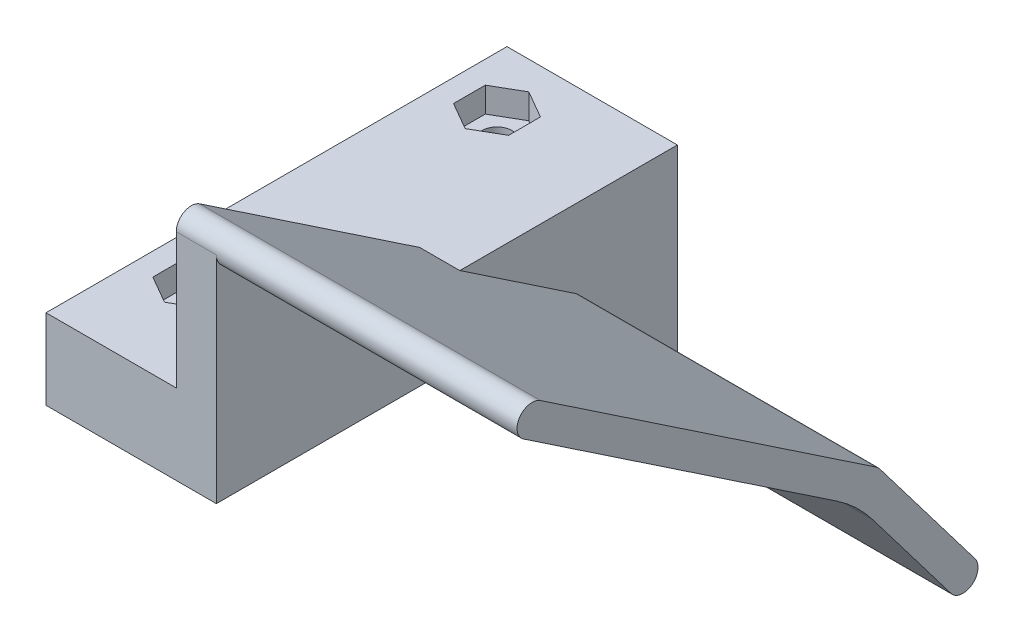
ISO-10303-21;
HEADER;
FILE_DESCRIPTION(('STEP AP214'),'2;1');
FILE_NAME('part.step','',(''),(''),'','','');
FILE_SCHEMA(('AUTOMOTIVE_DESIGN { 1 0 10303 214 1 1 1 1 }'));
ENDSEC;
DATA;
#1=APPLICATION_CONTEXT('core data for automotive mechanical design processes');
#2=APPLICATION_PROTOCOL_DEFINITION('international standard','automotive_design',2000,#1);
#3=PRODUCT_CONTEXT('',#1,'mechanical');
#4=PRODUCT('Part','Part','',(#3));
#5=PRODUCT_RELATED_PRODUCT_CATEGORY('part','',(#4));
#6=PRODUCT_DEFINITION_FORMATION('','',#4);
#7=PRODUCT_DEFINITION_CONTEXT('part definition',#1,'design');
#8=PRODUCT_DEFINITION('design','',#6,#7);
#9=PRODUCT_DEFINITION_SHAPE('','',#8);
#10=(LENGTH_UNIT() NAMED_UNIT(*) SI_UNIT(.MILLI.,.METRE.));
#11=(NAMED_UNIT(*) PLANE_ANGLE_UNIT() SI_UNIT($,.RADIAN.));
#12=(NAMED_UNIT(*) SI_UNIT($,.STERADIAN.) SOLID_ANGLE_UNIT());
#13=UNCERTAINTY_MEASURE_WITH_UNIT(LENGTH_MEASURE(1.E-05),#10,'distance_accuracy_value','');
#14=(GEOMETRIC_REPRESENTATION_CONTEXT(3) GLOBAL_UNCERTAINTY_ASSIGNED_CONTEXT((#13)) GLOBAL_UNIT_ASSIGNED_CONTEXT((#10,
#11,#12)) REPRESENTATION_CONTEXT('',''));
#15=CARTESIAN_POINT('',(0.,0.,0.));
#16=DIRECTION('',(0.,0.,1.));
#17=DIRECTION('',(1.,0.,0.));
#18=AXIS2_PLACEMENT_3D('',#15,#16,#17);
#19=CARTESIAN_POINT('',(61.,-8.,-10.));
#20=DIRECTION('',(0.,1.,0.));
#21=DIRECTION('',(0.,0.,-1.));
#22=AXIS2_PLACEMENT_3D('',#19,#20,#21);
#23=CYLINDRICAL_SURFACE('',#22,1.5);
#24=CARTESIAN_POINT('',(61.,-8.,-10.));
#25=DIRECTION('',(0.,-1.,0.));
#26=DIRECTION('',(0.,0.,-1.));
#27=AXIS2_PLACEMENT_3D('',#24,#25,#26);
#28=CIRCLE('',#27,1.5);
#29=CARTESIAN_POINT('',(61.,-8.,-11.5));
#30=VERTEX_POINT('',#29);
#31=EDGE_CURVE('E427',#30,#30,#28,.T.);
#32=ORIENTED_EDGE('',*,*,#31,.T.);
#33=EDGE_LOOP('',(#32));
#34=FACE_BOUND('',#33,.T.);
#35=CARTESIAN_POINT('',(61.,-2.5,-10.));
#36=DIRECTION('',(0.,-1.,0.));
#37=DIRECTION('',(0.,0.,-1.));
#38=AXIS2_PLACEMENT_3D('',#35,#36,#37);
#39=CIRCLE('',#38,1.5);
#40=CARTESIAN_POINT('',(61.,-2.5,-11.5));
#41=VERTEX_POINT('',#40);
#42=EDGE_CURVE('E51',#41,#41,#39,.F.);
#43=ORIENTED_EDGE('',*,*,#42,.T.);
#44=EDGE_LOOP('',(#43));
#45=FACE_BOUND('',#44,.T.);
#46=ADVANCED_FACE('F47',(#34,#45),#23,.F.);
#47=CARTESIAN_POINT('',(61.,-8.,-40.));
#48=DIRECTION('',(0.,1.,0.));
#49=DIRECTION('',(0.,0.,-1.));
#50=AXIS2_PLACEMENT_3D('',#47,#48,#49);
#51=CYLINDRICAL_SURFACE('',#50,1.5);
#52=CARTESIAN_POINT('',(61.,-8.,-40.));
#53=DIRECTION('',(0.,-1.,0.));
#54=DIRECTION('',(0.,0.,-1.));
#55=AXIS2_PLACEMENT_3D('',#52,#53,#54);
#56=CIRCLE('',#55,1.5);
#57=CARTESIAN_POINT('',(61.,-8.,-41.5));
#58=VERTEX_POINT('',#57);
#59=EDGE_CURVE('E416',#58,#58,#56,.T.);
#60=ORIENTED_EDGE('',*,*,#59,.T.);
#61=EDGE_LOOP('',(#60));
#62=FACE_BOUND('',#61,.T.);
#63=CARTESIAN_POINT('',(61.,-2.5,-40.));
#64=DIRECTION('',(0.,-1.,0.));
#65=DIRECTION('',(0.,0.,-1.));
#66=AXIS2_PLACEMENT_3D('',#63,#64,#65);
#67=CIRCLE('',#66,1.5);
#68=CARTESIAN_POINT('',(61.,-2.5,-41.5));
#69=VERTEX_POINT('',#68);
#70=EDGE_CURVE('E284',#69,#69,#67,.F.);
#71=ORIENTED_EDGE('',*,*,#70,.T.);
#72=EDGE_LOOP('',(#71));
#73=FACE_BOUND('',#72,.T.);
#74=ADVANCED_FACE('F483',(#62,#73),#51,.F.);
#75=CARTESIAN_POINT('',(56.,-8.,0.));
#76=DIRECTION('',(0.,0.,1.));
#77=DIRECTION('',(-1.,0.,0.));
#78=AXIS2_PLACEMENT_3D('',#75,#76,#77);
#79=PLANE('',#78);
#80=DIRECTION('',(0.,1.,0.));
#81=VECTOR('',#80,1.);
#82=CARTESIAN_POINT('',(69.,-23.,0.));
#83=LINE('',#82,#81);
#84=CARTESIAN_POINT('',(69.,0.,0.));
#85=VERTEX_POINT('',#84);
#86=CARTESIAN_POINT('',(69.,13.5,0.));
#87=VERTEX_POINT('',#86);
#88=EDGE_CURVE('E417',#85,#87,#83,.T.);
#89=ORIENTED_EDGE('',*,*,#88,.F.);
#90=DIRECTION('',(-1.,0.,0.));
#91=VECTOR('',#90,1.);
#92=CARTESIAN_POINT('',(56.,0.,0.));
#93=LINE('',#92,#91);
#94=CARTESIAN_POINT('',(56.,0.,0.));
#95=VERTEX_POINT('',#94);
#96=EDGE_CURVE('E448',#85,#95,#93,.T.);
#97=ORIENTED_EDGE('',*,*,#96,.T.);
#98=DIRECTION('',(0.,1.,0.));
#99=VECTOR('',#98,1.);
#100=CARTESIAN_POINT('',(56.,-8.,0.));
#101=LINE('',#100,#99);
#102=CARTESIAN_POINT('',(56.,-8.,0.));
#103=VERTEX_POINT('',#102);
#104=EDGE_CURVE('E443',#103,#95,#101,.T.);
#105=ORIENTED_EDGE('',*,*,#104,.F.);
#106=DIRECTION('',(-1.,0.,0.));
#107=VECTOR('',#106,1.);
#108=CARTESIAN_POINT('',(56.,-8.,0.));
#109=LINE('',#108,#107);
#110=CARTESIAN_POINT('',(73.,-8.,0.));
#111=VERTEX_POINT('',#110);
#112=EDGE_CURVE('E438',#111,#103,#109,.T.);
#113=ORIENTED_EDGE('',*,*,#112,.F.);
#114=DIRECTION('',(0.,1.,0.));
#115=VECTOR('',#114,1.);
#116=CARTESIAN_POINT('',(73.,-23.,0.));
#117=LINE('',#116,#115);
#118=CARTESIAN_POINT('',(73.,13.5,0.));
#119=VERTEX_POINT('',#118);
#120=EDGE_CURVE('E420',#111,#119,#117,.T.);
#121=ORIENTED_EDGE('',*,*,#120,.T.);
#122=DIRECTION('',(1.,0.,0.));
#123=VECTOR('',#122,1.);
#124=CARTESIAN_POINT('',(55.999,13.5,0.));
#125=LINE('',#124,#123);
#126=EDGE_CURVE('E337',#87,#119,#125,.T.);
#127=ORIENTED_EDGE('',*,*,#126,.F.);
#128=EDGE_LOOP('',(#89,#97,#105,#113,#121,#127));
#129=FACE_BOUND('',#128,.T.);
#130=ADVANCED_FACE('F489',(#129),#79,.T.);
#131=CARTESIAN_POINT('',(69.,-23.,-46.));
#132=DIRECTION('',(-1.,0.,0.));
#133=DIRECTION('',(0.,0.,-1.));
#134=AXIS2_PLACEMENT_3D('',#131,#132,#133);
#135=PLANE('',#134);
#136=CARTESIAN_POINT('',(69.,13.5,-1.5));
#137=DIRECTION('',(1.,0.,0.));
#138=DIRECTION('',(0.,0.,-1.));
#139=AXIS2_PLACEMENT_3D('',#136,#137,#138);
#140=CIRCLE('',#139,1.5);
#141=CARTESIAN_POINT('',(69.,14.7452088098158,-2.33633427524944));
#142=VERTEX_POINT('',#141);
#143=EDGE_CURVE('E344',#142,#87,#140,.T.);
#144=ORIENTED_EDGE('',*,*,#143,.F.);
#145=DIRECTION('',(0.,0.55755618349963,0.830139206543895));
#146=VECTOR('',#145,1.);
#147=CARTESIAN_POINT('',(69.,11.2427525617348,-7.55110246683679));
#148=LINE('',#147,#146);
#149=CARTESIAN_POINT('',(69.,0.,-24.2903118365308));
#150=VERTEX_POINT('',#149);
#151=EDGE_CURVE('E351',#150,#142,#148,.T.);
#152=ORIENTED_EDGE('',*,*,#151,.F.);
#153=DIRECTION('',(0.,0.,1.));
#154=VECTOR('',#153,1.);
#155=CARTESIAN_POINT('',(69.,0.,0.));
#156=LINE('',#155,#154);
#157=EDGE_CURVE('E446',#150,#85,#156,.T.);
#158=ORIENTED_EDGE('',*,*,#157,.T.);
#159=ORIENTED_EDGE('',*,*,#88,.T.);
#160=EDGE_LOOP('',(#144,#152,#158,#159));
#161=FACE_BOUND('',#160,.T.);
#162=ADVANCED_FACE('F509',(#161),#135,.T.);
#163=CARTESIAN_POINT('',(69.,-8.,-46.));
#164=DIRECTION('',(0.,0.,-1.));
#165=DIRECTION('',(1.,0.,0.));
#166=AXIS2_PLACEMENT_3D('',#163,#164,#165);
#167=PLANE('',#166);
#168=DIRECTION('',(0.,1.,0.));
#169=VECTOR('',#168,1.);
#170=CARTESIAN_POINT('',(69.,-23.,-46.));
#171=LINE('',#170,#169);
#172=CARTESIAN_POINT('',(69.,-21.5,-46.));
#173=VERTEX_POINT('',#172);
#174=CARTESIAN_POINT('',(69.,-8.,-46.));
#175=VERTEX_POINT('',#174);
#176=EDGE_CURVE('E413',#173,#175,#171,.T.);
#177=ORIENTED_EDGE('',*,*,#176,.T.);
#178=DIRECTION('',(1.,0.,0.));
#179=VECTOR('',#178,1.);
#180=CARTESIAN_POINT('',(69.,-8.,-46.));
#181=LINE('',#180,#179);
#182=CARTESIAN_POINT('',(56.,-8.,-46.));
#183=VERTEX_POINT('',#182);
#184=EDGE_CURVE('E431',#183,#175,#181,.T.);
#185=ORIENTED_EDGE('',*,*,#184,.F.);
#186=DIRECTION('',(0.,1.,0.));
#187=VECTOR('',#186,1.);
#188=CARTESIAN_POINT('',(56.,-8.,-46.));
#189=LINE('',#188,#187);
#190=CARTESIAN_POINT('',(56.,0.,-46.));
#191=VERTEX_POINT('',#190);
#192=EDGE_CURVE('E452',#183,#191,#189,.T.);
#193=ORIENTED_EDGE('',*,*,#192,.T.);
#194=DIRECTION('',(1.,0.,0.));
#195=VECTOR('',#194,1.);
#196=CARTESIAN_POINT('',(69.,0.,-46.));
#197=LINE('',#196,#195);
#198=CARTESIAN_POINT('',(73.,0.,-46.));
#199=VERTEX_POINT('',#198);
#200=EDGE_CURVE('E430',#191,#199,#197,.T.);
#201=ORIENTED_EDGE('',*,*,#200,.T.);
#202=DIRECTION('',(0.,1.,0.));
#203=VECTOR('',#202,1.);
#204=CARTESIAN_POINT('',(73.,-23.,-46.));
#205=LINE('',#204,#203);
#206=CARTESIAN_POINT('',(73.,-21.5,-46.));
#207=VERTEX_POINT('',#206);
#208=EDGE_CURVE('E412',#207,#199,#205,.T.);
#209=ORIENTED_EDGE('',*,*,#208,.F.);
#210=DIRECTION('',(1.,0.,0.));
#211=VECTOR('',#210,1.);
#212=CARTESIAN_POINT('',(55.999,-21.5,-46.));
#213=LINE('',#212,#211);
#214=EDGE_CURVE('E340',#173,#207,#213,.T.);
#215=ORIENTED_EDGE('',*,*,#214,.F.);
#216=EDGE_LOOP('',(#177,#185,#193,#201,#209,#215));
#217=FACE_BOUND('',#216,.T.);
#218=ADVANCED_FACE('F511',(#217),#167,.T.);
#219=CARTESIAN_POINT('',(69.,-21.5,-44.5));
#220=DIRECTION('',(1.,0.,0.));
#221=DIRECTION('',(0.,0.,-1.));
#222=AXIS2_PLACEMENT_3D('',#219,#220,#221);
#223=CIRCLE('',#222,1.5);
#224=CARTESIAN_POINT('',(69.,-22.4076249013003,-43.3057567088153));
#225=VERTEX_POINT('',#224);
#226=EDGE_CURVE('E360',#173,#225,#223,.F.);
#227=ORIENTED_EDGE('',*,*,#226,.T.);
#228=DIRECTION('',(0.,-0.796162194123103,-0.605083267533557));
#229=VECTOR('',#228,1.);
#230=CARTESIAN_POINT('',(69.,12.6582980195922,-16.6556552889371));
#231=LINE('',#230,#229);
#232=CARTESIAN_POINT('',(69.,-12.0915998308125,-35.4655776552446));
#233=VERTEX_POINT('',#232);
#234=EDGE_CURVE('E357',#233,#225,#231,.T.);
#235=ORIENTED_EDGE('',*,*,#234,.F.);
#236=CARTESIAN_POINT('',(69.,-21.1678488438159,-23.5231447433981));
#237=DIRECTION('',(1.,0.,0.));
#238=DIRECTION('',(0.,0.,-1.));
#239=AXIS2_PLACEMENT_3D('',#236,#237,#238);
#240=CIRCLE('',#239,15.);
#241=CARTESIAN_POINT('',(69.,-8.71576074565748,-31.8864874958925));
#242=VERTEX_POINT('',#241);
#243=EDGE_CURVE('E56',#242,#233,#240,.F.);
#244=ORIENTED_EDGE('',*,*,#243,.F.);
#245=DIRECTION('',(0.,0.55755618349963,0.830139206543895));
#246=VECTOR('',#245,1.);
#247=CARTESIAN_POINT('',(69.,8.75233494210309,-5.87843391633789));
#248=LINE('',#247,#246);
#249=CARTESIAN_POINT('',(69.,-8.,-30.8207992745803));
#250=VERTEX_POINT('',#249);
#251=EDGE_CURVE('E343',#242,#250,#248,.T.);
#252=ORIENTED_EDGE('',*,*,#251,.T.);
#253=DIRECTION('',(0.,0.,1.));
#254=VECTOR('',#253,1.);
#255=CARTESIAN_POINT('',(69.,-8.,0.));
#256=LINE('',#255,#254);
#257=EDGE_CURVE('E434',#175,#250,#256,.T.);
#258=ORIENTED_EDGE('',*,*,#257,.F.);
#259=ORIENTED_EDGE('',*,*,#176,.F.);
#260=EDGE_LOOP('',(#227,#235,#244,#252,#258,#259));
#261=FACE_BOUND('',#260,.T.);
#262=ADVANCED_FACE('F513',(#261),#135,.T.);
#263=CARTESIAN_POINT('',(73.,-23.,0.));
#264=DIRECTION('',(1.,0.,0.));
#265=DIRECTION('',(0.,0.,1.));
#266=AXIS2_PLACEMENT_3D('',#263,#264,#265);
#267=PLANE('',#266);
#268=DIRECTION('',(0.,-0.557556183499631,-0.830139206543894));
#269=VECTOR('',#268,1.);
#270=CARTESIAN_POINT('',(73.,8.7523349421031,-5.87843391633791));
#271=LINE('',#270,#269);
#272=CARTESIAN_POINT('',(73.,12.2547911901842,-0.663665724750555));
#273=VERTEX_POINT('',#272);
#274=CARTESIAN_POINT('',(73.,-7.99999999999999,-30.8207992745803));
#275=VERTEX_POINT('',#274);
#276=EDGE_CURVE('E397',#273,#275,#271,.T.);
#277=ORIENTED_EDGE('',*,*,#276,.F.);
#278=CARTESIAN_POINT('',(73.,13.5,-1.5));
#279=DIRECTION('',(-1.,0.,0.));
#280=DIRECTION('',(0.,0.,1.));
#281=AXIS2_PLACEMENT_3D('',#278,#279,#280);
#282=CIRCLE('',#281,1.5);
#283=EDGE_CURVE('E370',#273,#119,#282,.T.);
#284=ORIENTED_EDGE('',*,*,#283,.T.);
#285=ORIENTED_EDGE('',*,*,#120,.F.);
#286=DIRECTION('',(0.,0.,1.));
#287=VECTOR('',#286,1.);
#288=CARTESIAN_POINT('',(73.,-8.,0.));
#289=LINE('',#288,#287);
#290=EDGE_CURVE('E363',#275,#111,#289,.T.);
#291=ORIENTED_EDGE('',*,*,#290,.F.);
#292=EDGE_LOOP('',(#277,#284,#285,#291));
#293=FACE_BOUND('',#292,.T.);
#294=ADVANCED_FACE('F519',(#293),#267,.T.);
#295=DIRECTION('',(0.,-0.55755618349963,-0.830139206543895));
#296=VECTOR('',#295,1.);
#297=CARTESIAN_POINT('',(73.,11.2427525617348,-7.55110246683679));
#298=LINE('',#297,#296);
#299=CARTESIAN_POINT('',(73.,0.,-24.2903118365308));
#300=VERTEX_POINT('',#299);
#301=CARTESIAN_POINT('',(73.,-7.75479119018416,-35.8363342752494));
#302=VERTEX_POINT('',#301);
#303=EDGE_CURVE('E354',#300,#302,#298,.T.);
#304=ORIENTED_EDGE('',*,*,#303,.T.);
#305=CARTESIAN_POINT('',(73.,-9.,-35.));
#306=DIRECTION('',(-1.,0.,0.));
#307=DIRECTION('',(0.,0.,1.));
#308=AXIS2_PLACEMENT_3D('',#305,#306,#307);
#309=CIRCLE('',#308,1.49999999999999);
#310=CARTESIAN_POINT('',(73.,-8.09237509869968,-36.1942432911846));
#311=VERTEX_POINT('',#310);
#312=EDGE_CURVE('E389',#302,#311,#309,.T.);
#313=ORIENTED_EDGE('',*,*,#312,.T.);
#314=DIRECTION('',(0.,-0.796162194123103,-0.605083267533557));
#315=VECTOR('',#314,1.);
#316=CARTESIAN_POINT('',(73.,14.4735478221928,-19.0441418713064));
#317=LINE('',#316,#315);
#318=CARTESIAN_POINT('',(73.,-20.5923750986997,-45.6942432911846));
#319=VERTEX_POINT('',#318);
#320=EDGE_CURVE('E392',#311,#319,#317,.T.);
#321=ORIENTED_EDGE('',*,*,#320,.T.);
#322=CARTESIAN_POINT('',(73.,-21.5,-44.5));
#323=DIRECTION('',(-1.,0.,0.));
#324=DIRECTION('',(0.,0.,1.));
#325=AXIS2_PLACEMENT_3D('',#322,#323,#324);
#326=CIRCLE('',#325,1.49999999999999);
#327=EDGE_CURVE('E395',#319,#207,#326,.T.);
#328=ORIENTED_EDGE('',*,*,#327,.T.);
#329=ORIENTED_EDGE('',*,*,#208,.T.);
#330=DIRECTION('',(0.,0.,-1.));
#331=VECTOR('',#330,1.);
#332=CARTESIAN_POINT('',(73.,0.,0.));
#333=LINE('',#332,#331);
#334=EDGE_CURVE('E346',#300,#199,#333,.T.);
#335=ORIENTED_EDGE('',*,*,#334,.F.);
#336=EDGE_LOOP('',(#304,#313,#321,#328,#329,#335));
#337=FACE_BOUND('',#336,.T.);
#338=ADVANCED_FACE('F506',(#337),#267,.T.);
#339=CARTESIAN_POINT('',(56.,-8.,0.));
#340=DIRECTION('',(-1.,0.,0.));
#341=DIRECTION('',(0.,0.,-1.));
#342=AXIS2_PLACEMENT_3D('',#339,#340,#341);
#343=PLANE('',#342);
#344=DIRECTION('',(0.,0.,-1.));
#345=VECTOR('',#344,1.);
#346=CARTESIAN_POINT('',(56.,0.,0.));
#347=LINE('',#346,#345);
#348=EDGE_CURVE('E435',#95,#191,#347,.T.);
#349=ORIENTED_EDGE('',*,*,#348,.T.);
#350=ORIENTED_EDGE('',*,*,#192,.F.);
#351=DIRECTION('',(0.,0.,-1.));
#352=VECTOR('',#351,1.);
#353=CARTESIAN_POINT('',(56.,-8.,0.));
#354=LINE('',#353,#352);
#355=EDGE_CURVE('E441',#103,#183,#354,.T.);
#356=ORIENTED_EDGE('',*,*,#355,.F.);
#357=ORIENTED_EDGE('',*,*,#104,.T.);
#358=EDGE_LOOP('',(#349,#350,#356,#357));
#359=FACE_BOUND('',#358,.T.);
#360=ADVANCED_FACE('F498',(#359),#343,.T.);
#361=CARTESIAN_POINT('',(0.,-8.,0.));
#362=DIRECTION('',(0.,1.,0.));
#363=DIRECTION('',(0.,0.,-1.));
#364=AXIS2_PLACEMENT_3D('',#361,#362,#363);
#365=PLANE('',#364);
#366=ORIENTED_EDGE('',*,*,#59,.F.);
#367=EDGE_LOOP('',(#366));
#368=FACE_BOUND('',#367,.T.);
#369=ORIENTED_EDGE('',*,*,#31,.F.);
#370=EDGE_LOOP('',(#369));
#371=FACE_BOUND('',#370,.T.);
#372=ORIENTED_EDGE('',*,*,#184,.T.);
#373=ORIENTED_EDGE('',*,*,#257,.T.);
#374=DIRECTION('',(1.,0.,0.));
#375=VECTOR('',#374,1.);
#376=CARTESIAN_POINT('',(55.999,-8.,-30.8207992745803));
#377=LINE('',#376,#375);
#378=EDGE_CURVE('E347',#250,#275,#377,.T.);
#379=ORIENTED_EDGE('',*,*,#378,.T.);
#380=ORIENTED_EDGE('',*,*,#290,.T.);
#381=ORIENTED_EDGE('',*,*,#112,.T.);
#382=ORIENTED_EDGE('',*,*,#355,.T.);
#383=EDGE_LOOP('',(#372,#373,#379,#380,#381,#382));
#384=FACE_BOUND('',#383,.T.);
#385=ADVANCED_FACE('F494',(#368,#371,#384),#365,.F.);
#386=CARTESIAN_POINT('',(0.,0.,0.));
#387=DIRECTION('',(0.,1.,0.));
#388=DIRECTION('',(0.,0.,-1.));
#389=AXIS2_PLACEMENT_3D('',#386,#387,#388);
#390=PLANE('',#389);
#391=DIRECTION('',(0.866025403784437,0.,0.500000000000003));
#392=VECTOR('',#391,1.);
#393=CARTESIAN_POINT('',(61.,0.,-13.1754264805429));
#394=LINE('',#393,#392);
#395=CARTESIAN_POINT('',(61.,0.,-13.1754264805429));
#396=VERTEX_POINT('',#395);
#397=CARTESIAN_POINT('',(63.75,0.,-11.5877132402715));
#398=VERTEX_POINT('',#397);
#399=EDGE_CURVE('E271',#396,#398,#394,.T.);
#400=ORIENTED_EDGE('',*,*,#399,.T.);
#401=DIRECTION('',(0.,0.,1.));
#402=VECTOR('',#401,1.);
#403=CARTESIAN_POINT('',(63.75,0.,-11.5877132402715));
#404=LINE('',#403,#402);
#405=CARTESIAN_POINT('',(63.75,0.,-8.41228675972853));
#406=VERTEX_POINT('',#405);
#407=EDGE_CURVE('E239',#398,#406,#404,.T.);
#408=ORIENTED_EDGE('',*,*,#407,.T.);
#409=DIRECTION('',(-0.866025403784439,0.,0.499999999999999));
#410=VECTOR('',#409,1.);
#411=CARTESIAN_POINT('',(63.75,0.,-8.41228675972853));
#412=LINE('',#411,#410);
#413=CARTESIAN_POINT('',(61.,0.,-6.82457351945707));
#414=VERTEX_POINT('',#413);
#415=EDGE_CURVE('E275',#406,#414,#412,.T.);
#416=ORIENTED_EDGE('',*,*,#415,.T.);
#417=DIRECTION('',(-0.866025403784437,0.,-0.500000000000002));
#418=VECTOR('',#417,1.);
#419=CARTESIAN_POINT('',(61.,0.,-6.82457351945707));
#420=LINE('',#419,#418);
#421=CARTESIAN_POINT('',(58.25,0.,-8.41228675972854));
#422=VERTEX_POINT('',#421);
#423=EDGE_CURVE('E278',#414,#422,#420,.T.);
#424=ORIENTED_EDGE('',*,*,#423,.T.);
#425=DIRECTION('',(0.,0.,-1.));
#426=VECTOR('',#425,1.);
#427=CARTESIAN_POINT('',(58.25,0.,-8.41228675972854));
#428=LINE('',#427,#426);
#429=CARTESIAN_POINT('',(58.25,0.,-11.5877132402715));
#430=VERTEX_POINT('',#429);
#431=EDGE_CURVE('E260',#422,#430,#428,.T.);
#432=ORIENTED_EDGE('',*,*,#431,.T.);
#433=DIRECTION('',(0.866025403784439,0.,-0.5));
#434=VECTOR('',#433,1.);
#435=CARTESIAN_POINT('',(58.25,0.,-11.5877132402715));
#436=LINE('',#435,#434);
#437=EDGE_CURVE('E257',#430,#396,#436,.T.);
#438=ORIENTED_EDGE('',*,*,#437,.T.);
#439=EDGE_LOOP('',(#400,#408,#416,#424,#432,#438));
#440=FACE_BOUND('',#439,.T.);
#441=DIRECTION('',(0.866025403784438,0.,-0.5));
#442=VECTOR('',#441,1.);
#443=CARTESIAN_POINT('',(58.25,0.,-41.5877132402715));
#444=LINE('',#443,#442);
#445=CARTESIAN_POINT('',(58.25,0.,-41.5877132402715));
#446=VERTEX_POINT('',#445);
#447=CARTESIAN_POINT('',(61.,0.,-43.175426480543));
#448=VERTEX_POINT('',#447);
#449=EDGE_CURVE('E273',#446,#448,#444,.T.);
#450=ORIENTED_EDGE('',*,*,#449,.T.);
#451=DIRECTION('',(0.866025403784439,0.,0.5));
#452=VECTOR('',#451,1.);
#453=CARTESIAN_POINT('',(61.,0.,-43.1754264805429));
#454=LINE('',#453,#452);
#455=CARTESIAN_POINT('',(63.75,0.,-41.5877132402715));
#456=VERTEX_POINT('',#455);
#457=EDGE_CURVE('E317',#448,#456,#454,.T.);
#458=ORIENTED_EDGE('',*,*,#457,.T.);
#459=DIRECTION('',(0.,0.,1.));
#460=VECTOR('',#459,1.);
#461=CARTESIAN_POINT('',(63.75,0.,-41.5877132402715));
#462=LINE('',#461,#460);
#463=CARTESIAN_POINT('',(63.75,0.,-38.4122867597286));
#464=VERTEX_POINT('',#463);
#465=EDGE_CURVE('E314',#456,#464,#462,.T.);
#466=ORIENTED_EDGE('',*,*,#465,.T.);
#467=DIRECTION('',(-0.866025403784437,0.,0.500000000000002));
#468=VECTOR('',#467,1.);
#469=CARTESIAN_POINT('',(63.75,0.,-38.4122867597286));
#470=LINE('',#469,#468);
#471=CARTESIAN_POINT('',(61.,0.,-36.8245735194571));
#472=VERTEX_POINT('',#471);
#473=EDGE_CURVE('E311',#464,#472,#470,.T.);
#474=ORIENTED_EDGE('',*,*,#473,.T.);
#475=DIRECTION('',(-0.866025403784442,0.,-0.499999999999994));
#476=VECTOR('',#475,1.);
#477=CARTESIAN_POINT('',(61.,0.,-36.8245735194571));
#478=LINE('',#477,#476);
#479=CARTESIAN_POINT('',(58.25,0.,-38.4122867597285));
#480=VERTEX_POINT('',#479);
#481=EDGE_CURVE('E307',#472,#480,#478,.T.);
#482=ORIENTED_EDGE('',*,*,#481,.T.);
#483=DIRECTION('',(0.,0.,-1.));
#484=VECTOR('',#483,1.);
#485=CARTESIAN_POINT('',(58.25,0.,-38.4122867597285));
#486=LINE('',#485,#484);
#487=EDGE_CURVE('E304',#480,#446,#486,.T.);
#488=ORIENTED_EDGE('',*,*,#487,.T.);
#489=EDGE_LOOP('',(#450,#458,#466,#474,#482,#488));
#490=FACE_BOUND('',#489,.T.);
#491=ORIENTED_EDGE('',*,*,#200,.F.);
#492=ORIENTED_EDGE('',*,*,#348,.F.);
#493=ORIENTED_EDGE('',*,*,#96,.F.);
#494=ORIENTED_EDGE('',*,*,#157,.F.);
#495=DIRECTION('',(1.,0.,0.));
#496=VECTOR('',#495,1.);
#497=CARTESIAN_POINT('',(55.999,0.,-24.2903118365308));
#498=LINE('',#497,#496);
#499=EDGE_CURVE('E349',#150,#300,#498,.T.);
#500=ORIENTED_EDGE('',*,*,#499,.T.);
#501=ORIENTED_EDGE('',*,*,#334,.T.);
#502=EDGE_LOOP('',(#491,#492,#493,#494,#500,#501));
#503=FACE_BOUND('',#502,.T.);
#504=ADVANCED_FACE('F497',(#440,#490,#503),#390,.T.);
#505=CARTESIAN_POINT('',(103.,11.2427525617348,-7.55110246683679));
#506=DIRECTION('',(0.,-0.830139206543894,0.55755618349963));
#507=DIRECTION('',(0.,0.55755618349963,0.830139206543895));
#508=AXIS2_PLACEMENT_3D('',#505,#506,#507);
#509=PLANE('',#508);
#510=DIRECTION('',(-1.,0.,0.));
#511=VECTOR('',#510,1.);
#512=CARTESIAN_POINT('',(103.,14.7452088098158,-2.33633427524945));
#513=LINE('',#512,#511);
#514=CARTESIAN_POINT('',(103.,14.7452088098158,-2.33633427524945));
#515=VERTEX_POINT('',#514);
#516=EDGE_CURVE('E386',#515,#142,#513,.T.);
#517=ORIENTED_EDGE('',*,*,#516,.F.);
#518=DIRECTION('',(0.,-0.55755618349963,-0.830139206543895));
#519=VECTOR('',#518,1.);
#520=CARTESIAN_POINT('',(103.,11.2427525617348,-7.55110246683679));
#521=LINE('',#520,#519);
#522=CARTESIAN_POINT('',(103.,-7.75479119018416,-35.8363342752494));
#523=VERTEX_POINT('',#522);
#524=EDGE_CURVE('E366',#515,#523,#521,.T.);
#525=ORIENTED_EDGE('',*,*,#524,.T.);
#526=DIRECTION('',(-1.,0.,0.));
#527=VECTOR('',#526,1.);
#528=CARTESIAN_POINT('',(103.,-7.75479119018416,-35.8363342752494));
#529=LINE('',#528,#527);
#530=EDGE_CURVE('E410',#523,#302,#529,.T.);
#531=ORIENTED_EDGE('',*,*,#530,.T.);
#532=ORIENTED_EDGE('',*,*,#303,.F.);
#533=ORIENTED_EDGE('',*,*,#499,.F.);
#534=ORIENTED_EDGE('',*,*,#151,.T.);
#535=EDGE_LOOP('',(#517,#525,#531,#532,#533,#534));
#536=FACE_BOUND('',#535,.T.);
#537=ADVANCED_FACE('F502',(#536),#509,.F.);
#538=CARTESIAN_POINT('',(103.,-9.,-35.));
#539=DIRECTION('',(-1.,0.,0.));
#540=DIRECTION('',(0.,0.,-1.));
#541=AXIS2_PLACEMENT_3D('',#538,#539,#540);
#542=CYLINDRICAL_SURFACE('',#541,1.49999999999999);
#543=ORIENTED_EDGE('',*,*,#312,.F.);
#544=ORIENTED_EDGE('',*,*,#530,.F.);
#545=CARTESIAN_POINT('',(103.,-9.,-35.));
#546=DIRECTION('',(-1.,0.,0.));
#547=DIRECTION('',(0.,0.,1.));
#548=AXIS2_PLACEMENT_3D('',#545,#546,#547);
#549=CIRCLE('',#548,1.49999999999999);
#550=CARTESIAN_POINT('',(103.,-8.09237509869968,-36.1942432911846));
#551=VERTEX_POINT('',#550);
#552=EDGE_CURVE('E369',#523,#551,#549,.T.);
#553=ORIENTED_EDGE('',*,*,#552,.T.);
#554=DIRECTION('',(-1.,0.,0.));
#555=VECTOR('',#554,1.);
#556=CARTESIAN_POINT('',(103.,-8.09237509869968,-36.1942432911846));
#557=LINE('',#556,#555);
#558=EDGE_CURVE('E408',#551,#311,#557,.T.);
#559=ORIENTED_EDGE('',*,*,#558,.T.);
#560=EDGE_LOOP('',(#543,#544,#553,#559));
#561=FACE_BOUND('',#560,.T.);
#562=ADVANCED_FACE('F569',(#561),#542,.T.);
#563=CARTESIAN_POINT('',(103.,14.4735478221928,-19.0441418713064));
#564=DIRECTION('',(0.,-0.605083267533557,0.796162194123103));
#565=DIRECTION('',(0.,0.796162194123103,0.605083267533557));
#566=AXIS2_PLACEMENT_3D('',#563,#564,#565);
#567=PLANE('',#566);
#568=ORIENTED_EDGE('',*,*,#320,.F.);
#569=ORIENTED_EDGE('',*,*,#558,.F.);
#570=DIRECTION('',(0.,-0.796162194123103,-0.605083267533557));
#571=VECTOR('',#570,1.);
#572=CARTESIAN_POINT('',(103.,14.4735478221928,-19.0441418713064));
#573=LINE('',#572,#571);
#574=CARTESIAN_POINT('',(103.,-20.5923750986997,-45.6942432911846));
#575=VERTEX_POINT('',#574);
#576=EDGE_CURVE('E373',#551,#575,#573,.T.);
#577=ORIENTED_EDGE('',*,*,#576,.T.);
#578=DIRECTION('',(-1.,0.,0.));
#579=VECTOR('',#578,1.);
#580=CARTESIAN_POINT('',(103.,-20.5923750986997,-45.6942432911846));
#581=LINE('',#580,#579);
#582=EDGE_CURVE('E406',#575,#319,#581,.T.);
#583=ORIENTED_EDGE('',*,*,#582,.T.);
#584=EDGE_LOOP('',(#568,#569,#577,#583));
#585=FACE_BOUND('',#584,.T.);
#586=ADVANCED_FACE('F572',(#585),#567,.F.);
#587=CARTESIAN_POINT('',(103.,-21.5,-44.5));
#588=DIRECTION('',(-1.,0.,0.));
#589=DIRECTION('',(0.,0.,-1.));
#590=AXIS2_PLACEMENT_3D('',#587,#588,#589);
#591=CYLINDRICAL_SURFACE('',#590,1.49999999999999);
#592=ORIENTED_EDGE('',*,*,#327,.F.);
#593=ORIENTED_EDGE('',*,*,#582,.F.);
#594=CARTESIAN_POINT('',(103.,-21.5,-44.5));
#595=DIRECTION('',(-1.,0.,0.));
#596=DIRECTION('',(0.,0.,1.));
#597=AXIS2_PLACEMENT_3D('',#594,#595,#596);
#598=CIRCLE('',#597,1.49999999999999);
#599=CARTESIAN_POINT('',(103.,-22.4076249013003,-43.3057567088153));
#600=VERTEX_POINT('',#599);
#601=EDGE_CURVE('E376',#575,#600,#598,.T.);
#602=ORIENTED_EDGE('',*,*,#601,.T.);
#603=DIRECTION('',(-1.,0.,0.));
#604=VECTOR('',#603,1.);
#605=CARTESIAN_POINT('',(103.,-22.4076249013003,-43.3057567088153));
#606=LINE('',#605,#604);
#607=EDGE_CURVE('E404',#600,#225,#606,.T.);
#608=ORIENTED_EDGE('',*,*,#607,.T.);
#609=ORIENTED_EDGE('',*,*,#226,.F.);
#610=ORIENTED_EDGE('',*,*,#214,.T.);
#611=EDGE_LOOP('',(#592,#593,#602,#608,#609,#610));
#612=FACE_BOUND('',#611,.T.);
#613=ADVANCED_FACE('F545',(#612),#591,.T.);
#614=CARTESIAN_POINT('',(103.,12.6582980195922,-16.6556552889371));
#615=DIRECTION('',(0.,-0.605083267533557,0.796162194123103));
#616=DIRECTION('',(0.,0.796162194123103,0.605083267533557));
#617=AXIS2_PLACEMENT_3D('',#614,#615,#616);
#618=PLANE('',#617);
#619=ORIENTED_EDGE('',*,*,#234,.T.);
#620=ORIENTED_EDGE('',*,*,#607,.F.);
#621=DIRECTION('',(0.,-0.796162194123103,-0.605083267533557));
#622=VECTOR('',#621,1.);
#623=CARTESIAN_POINT('',(103.,12.6582980195922,-16.6556552889371));
#624=LINE('',#623,#622);
#625=CARTESIAN_POINT('',(103.,-12.0915998308125,-35.4655776552446));
#626=VERTEX_POINT('',#625);
#627=EDGE_CURVE('E379',#626,#600,#624,.T.);
#628=ORIENTED_EDGE('',*,*,#627,.F.);
#629=DIRECTION('',(-1.,0.,0.));
#630=VECTOR('',#629,1.);
#631=CARTESIAN_POINT('',(103.,-12.0915998308125,-35.4655776552446));
#632=LINE('',#631,#630);
#633=EDGE_CURVE('E459',#233,#626,#632,.F.);
#634=ORIENTED_EDGE('',*,*,#633,.F.);
#635=EDGE_LOOP('',(#619,#620,#628,#634));
#636=FACE_BOUND('',#635,.T.);
#637=ADVANCED_FACE('F549',(#636),#618,.T.);
#638=CARTESIAN_POINT('',(103.,8.7523349421031,-5.87843391633791));
#639=DIRECTION('',(0.,-0.830139206543894,0.557556183499631));
#640=DIRECTION('',(0.,0.557556183499631,0.830139206543894));
#641=AXIS2_PLACEMENT_3D('',#638,#639,#640);
#642=PLANE('',#641);
#643=DIRECTION('',(0.,-0.557556183499631,-0.830139206543894));
#644=VECTOR('',#643,1.);
#645=CARTESIAN_POINT('',(103.,8.7523349421031,-5.87843391633791));
#646=LINE('',#645,#644);
#647=CARTESIAN_POINT('',(103.,12.2547911901842,-0.663665724750555));
#648=VERTEX_POINT('',#647);
#649=CARTESIAN_POINT('',(103.,-8.71576074565747,-31.8864874958925));
#650=VERTEX_POINT('',#649);
#651=EDGE_CURVE('E381',#648,#650,#646,.T.);
#652=ORIENTED_EDGE('',*,*,#651,.F.);
#653=DIRECTION('',(-1.,0.,0.));
#654=VECTOR('',#653,1.);
#655=CARTESIAN_POINT('',(103.,12.2547911901842,-0.663665724750555));
#656=LINE('',#655,#654);
#657=EDGE_CURVE('E402',#648,#273,#656,.T.);
#658=ORIENTED_EDGE('',*,*,#657,.T.);
#659=ORIENTED_EDGE('',*,*,#276,.T.);
#660=ORIENTED_EDGE('',*,*,#378,.F.);
#661=ORIENTED_EDGE('',*,*,#251,.F.);
#662=DIRECTION('',(-1.,0.,0.));
#663=VECTOR('',#662,1.);
#664=CARTESIAN_POINT('',(69.,-8.71576074565748,-31.8864874958925));
#665=LINE('',#664,#663);
#666=EDGE_CURVE('E455',#650,#242,#665,.T.);
#667=ORIENTED_EDGE('',*,*,#666,.F.);
#668=EDGE_LOOP('',(#652,#658,#659,#660,#661,#667));
#669=FACE_BOUND('',#668,.T.);
#670=ADVANCED_FACE('F554',(#669),#642,.T.);
#671=CARTESIAN_POINT('',(103.,13.5,-1.5));
#672=DIRECTION('',(-1.,0.,0.));
#673=DIRECTION('',(0.,0.,-1.));
#674=AXIS2_PLACEMENT_3D('',#671,#672,#673);
#675=CYLINDRICAL_SURFACE('',#674,1.5);
#676=ORIENTED_EDGE('',*,*,#283,.F.);
#677=ORIENTED_EDGE('',*,*,#657,.F.);
#678=CARTESIAN_POINT('',(103.,13.5,-1.5));
#679=DIRECTION('',(-1.,0.,0.));
#680=DIRECTION('',(0.,0.,1.));
#681=AXIS2_PLACEMENT_3D('',#678,#679,#680);
#682=CIRCLE('',#681,1.5);
#683=EDGE_CURVE('E384',#648,#515,#682,.T.);
#684=ORIENTED_EDGE('',*,*,#683,.T.);
#685=ORIENTED_EDGE('',*,*,#516,.T.);
#686=ORIENTED_EDGE('',*,*,#143,.T.);
#687=ORIENTED_EDGE('',*,*,#126,.T.);
#688=EDGE_LOOP('',(#676,#677,#684,#685,#686,#687));
#689=FACE_BOUND('',#688,.T.);
#690=ADVANCED_FACE('F578',(#689),#675,.T.);
#691=CARTESIAN_POINT('',(103.,0.,0.));
#692=DIRECTION('',(1.,0.,0.));
#693=DIRECTION('',(0.,0.,1.));
#694=AXIS2_PLACEMENT_3D('',#691,#692,#693);
#695=PLANE('',#694);
#696=ORIENTED_EDGE('',*,*,#524,.F.);
#697=ORIENTED_EDGE('',*,*,#683,.F.);
#698=ORIENTED_EDGE('',*,*,#651,.T.);
#699=CARTESIAN_POINT('',(103.,-21.1678488438159,-23.5231447433981));
#700=DIRECTION('',(-1.,0.,0.));
#701=DIRECTION('',(0.,0.,1.));
#702=AXIS2_PLACEMENT_3D('',#699,#700,#701);
#703=CIRCLE('',#702,15.);
#704=EDGE_CURVE('E11',#626,#650,#703,.F.);
#705=ORIENTED_EDGE('',*,*,#704,.F.);
#706=ORIENTED_EDGE('',*,*,#627,.T.);
#707=ORIENTED_EDGE('',*,*,#601,.F.);
#708=ORIENTED_EDGE('',*,*,#576,.F.);
#709=ORIENTED_EDGE('',*,*,#552,.F.);
#710=EDGE_LOOP('',(#696,#697,#698,#705,#706,#707,#708,#709));
#711=FACE_BOUND('',#710,.T.);
#712=ADVANCED_FACE('F575',(#711),#695,.T.);
#713=CARTESIAN_POINT('',(103.,-21.1678488438159,-23.5231447433981));
#714=DIRECTION('',(1.,0.,0.));
#715=DIRECTION('',(0.,0.,1.));
#716=AXIS2_PLACEMENT_3D('',#713,#714,#715);
#717=CYLINDRICAL_SURFACE('',#716,15.);
#718=ORIENTED_EDGE('',*,*,#704,.T.);
#719=ORIENTED_EDGE('',*,*,#666,.T.);
#720=ORIENTED_EDGE('',*,*,#243,.T.);
#721=ORIENTED_EDGE('',*,*,#633,.T.);
#722=EDGE_LOOP('',(#718,#719,#720,#721));
#723=FACE_BOUND('',#722,.T.);
#724=ADVANCED_FACE('F49',(#723),#717,.F.);
#725=CARTESIAN_POINT('',(0.,-2.5,0.));
#726=DIRECTION('',(0.,1.,0.));
#727=DIRECTION('',(0.,0.,-1.));
#728=AXIS2_PLACEMENT_3D('',#725,#726,#727);
#729=PLANE('',#728);
#730=DIRECTION('',(0.866025403784438,0.,-0.5));
#731=VECTOR('',#730,1.);
#732=CARTESIAN_POINT('',(58.25,-2.5,-41.5877132402715));
#733=LINE('',#732,#731);
#734=CARTESIAN_POINT('',(58.25,-2.5,-41.5877132402715));
#735=VERTEX_POINT('',#734);
#736=CARTESIAN_POINT('',(61.,-2.5,-43.1754264805429));
#737=VERTEX_POINT('',#736);
#738=EDGE_CURVE('E308',#735,#737,#733,.T.);
#739=ORIENTED_EDGE('',*,*,#738,.F.);
#740=DIRECTION('',(0.,0.,-1.));
#741=VECTOR('',#740,1.);
#742=CARTESIAN_POINT('',(58.25,-2.5,-38.4122867597285));
#743=LINE('',#742,#741);
#744=CARTESIAN_POINT('',(58.25,-2.5,-38.4122867597285));
#745=VERTEX_POINT('',#744);
#746=EDGE_CURVE('E293',#745,#735,#743,.T.);
#747=ORIENTED_EDGE('',*,*,#746,.F.);
#748=DIRECTION('',(-0.866025403784442,0.,-0.499999999999994));
#749=VECTOR('',#748,1.);
#750=CARTESIAN_POINT('',(61.,-2.5,-36.8245735194571));
#751=LINE('',#750,#749);
#752=CARTESIAN_POINT('',(61.,-2.5,-36.8245735194571));
#753=VERTEX_POINT('',#752);
#754=EDGE_CURVE('E324',#753,#745,#751,.T.);
#755=ORIENTED_EDGE('',*,*,#754,.F.);
#756=DIRECTION('',(-0.866025403784437,0.,0.500000000000002));
#757=VECTOR('',#756,1.);
#758=CARTESIAN_POINT('',(63.75,-2.5,-38.4122867597286));
#759=LINE('',#758,#757);
#760=CARTESIAN_POINT('',(63.75,-2.5,-38.4122867597286));
#761=VERTEX_POINT('',#760);
#762=EDGE_CURVE('E327',#761,#753,#759,.T.);
#763=ORIENTED_EDGE('',*,*,#762,.F.);
#764=DIRECTION('',(0.,0.,1.));
#765=VECTOR('',#764,1.);
#766=CARTESIAN_POINT('',(63.75,-2.5,-41.5877132402715));
#767=LINE('',#766,#765);
#768=CARTESIAN_POINT('',(63.75,-2.5,-41.5877132402715));
#769=VERTEX_POINT('',#768);
#770=EDGE_CURVE('E330',#769,#761,#767,.T.);
#771=ORIENTED_EDGE('',*,*,#770,.F.);
#772=DIRECTION('',(0.866025403784439,0.,0.5));
#773=VECTOR('',#772,1.);
#774=CARTESIAN_POINT('',(61.,-2.5,-43.1754264805429));
#775=LINE('',#774,#773);
#776=EDGE_CURVE('E333',#737,#769,#775,.T.);
#777=ORIENTED_EDGE('',*,*,#776,.F.);
#778=EDGE_LOOP('',(#739,#747,#755,#763,#771,#777));
#779=FACE_BOUND('',#778,.T.);
#780=ORIENTED_EDGE('',*,*,#70,.F.);
#781=EDGE_LOOP('',(#780));
#782=FACE_BOUND('',#781,.T.);
#783=ADVANCED_FACE('F664',(#779,#782),#729,.T.);
#784=CARTESIAN_POINT('',(58.25,-2.5,-41.5877132402715));
#785=DIRECTION('',(-0.5,0.,-0.866025403784438));
#786=DIRECTION('',(0.866025403784438,0.,-0.5));
#787=AXIS2_PLACEMENT_3D('',#784,#785,#786);
#788=PLANE('',#787);
#789=ORIENTED_EDGE('',*,*,#449,.F.);
#790=DIRECTION('',(0.,1.,0.));
#791=VECTOR('',#790,1.);
#792=CARTESIAN_POINT('',(58.25,-2.5,-41.5877132402715));
#793=LINE('',#792,#791);
#794=EDGE_CURVE('E302',#735,#446,#793,.T.);
#795=ORIENTED_EDGE('',*,*,#794,.F.);
#796=ORIENTED_EDGE('',*,*,#738,.T.);
#797=DIRECTION('',(0.,1.,0.));
#798=VECTOR('',#797,1.);
#799=CARTESIAN_POINT('',(61.,-2.5,-43.1754264805429));
#800=LINE('',#799,#798);
#801=EDGE_CURVE('E72',#737,#448,#800,.T.);
#802=ORIENTED_EDGE('',*,*,#801,.T.);
#803=EDGE_LOOP('',(#789,#795,#796,#802));
#804=FACE_BOUND('',#803,.T.);
#805=ADVANCED_FACE('F673',(#804),#788,.F.);
#806=CARTESIAN_POINT('',(58.25,-2.5,-38.4122867597285));
#807=DIRECTION('',(-1.,0.,0.));
#808=DIRECTION('',(0.,0.,-1.));
#809=AXIS2_PLACEMENT_3D('',#806,#807,#808);
#810=PLANE('',#809);
#811=ORIENTED_EDGE('',*,*,#487,.F.);
#812=DIRECTION('',(0.,1.,0.));
#813=VECTOR('',#812,1.);
#814=CARTESIAN_POINT('',(58.25,-2.5,-38.4122867597285));
#815=LINE('',#814,#813);
#816=EDGE_CURVE('E300',#745,#480,#815,.T.);
#817=ORIENTED_EDGE('',*,*,#816,.F.);
#818=ORIENTED_EDGE('',*,*,#746,.T.);
#819=ORIENTED_EDGE('',*,*,#794,.T.);
#820=EDGE_LOOP('',(#811,#817,#818,#819));
#821=FACE_BOUND('',#820,.T.);
#822=ADVANCED_FACE('F683',(#821),#810,.F.);
#823=CARTESIAN_POINT('',(61.,-2.5,-36.8245735194571));
#824=DIRECTION('',(-0.499999999999994,0.,0.866025403784442));
#825=DIRECTION('',(-0.866025403784442,0.,-0.499999999999994));
#826=AXIS2_PLACEMENT_3D('',#823,#824,#825);
#827=PLANE('',#826);
#828=ORIENTED_EDGE('',*,*,#481,.F.);
#829=DIRECTION('',(0.,1.,0.));
#830=VECTOR('',#829,1.);
#831=CARTESIAN_POINT('',(61.,-2.5,-36.8245735194571));
#832=LINE('',#831,#830);
#833=EDGE_CURVE('E298',#753,#472,#832,.T.);
#834=ORIENTED_EDGE('',*,*,#833,.F.);
#835=ORIENTED_EDGE('',*,*,#754,.T.);
#836=ORIENTED_EDGE('',*,*,#816,.T.);
#837=EDGE_LOOP('',(#828,#834,#835,#836));
#838=FACE_BOUND('',#837,.T.);
#839=ADVANCED_FACE('F693',(#838),#827,.F.);
#840=CARTESIAN_POINT('',(63.75,-2.5,-38.4122867597286));
#841=DIRECTION('',(0.500000000000002,0.,0.866025403784437));
#842=DIRECTION('',(-0.866025403784437,0.,0.500000000000002));
#843=AXIS2_PLACEMENT_3D('',#840,#841,#842);
#844=PLANE('',#843);
#845=ORIENTED_EDGE('',*,*,#473,.F.);
#846=DIRECTION('',(0.,1.,0.));
#847=VECTOR('',#846,1.);
#848=CARTESIAN_POINT('',(63.75,-2.5,-38.4122867597286));
#849=LINE('',#848,#847);
#850=EDGE_CURVE('E296',#761,#464,#849,.T.);
#851=ORIENTED_EDGE('',*,*,#850,.F.);
#852=ORIENTED_EDGE('',*,*,#762,.T.);
#853=ORIENTED_EDGE('',*,*,#833,.T.);
#854=EDGE_LOOP('',(#845,#851,#852,#853));
#855=FACE_BOUND('',#854,.T.);
#856=ADVANCED_FACE('F704',(#855),#844,.F.);
#857=CARTESIAN_POINT('',(63.75,-2.5,-41.5877132402715));
#858=DIRECTION('',(1.,0.,0.));
#859=DIRECTION('',(0.,0.,1.));
#860=AXIS2_PLACEMENT_3D('',#857,#858,#859);
#861=PLANE('',#860);
#862=ORIENTED_EDGE('',*,*,#465,.F.);
#863=DIRECTION('',(0.,1.,0.));
#864=VECTOR('',#863,1.);
#865=CARTESIAN_POINT('',(63.75,-2.5,-41.5877132402715));
#866=LINE('',#865,#864);
#867=EDGE_CURVE('E294',#769,#456,#866,.T.);
#868=ORIENTED_EDGE('',*,*,#867,.F.);
#869=ORIENTED_EDGE('',*,*,#770,.T.);
#870=ORIENTED_EDGE('',*,*,#850,.T.);
#871=EDGE_LOOP('',(#862,#868,#869,#870));
#872=FACE_BOUND('',#871,.T.);
#873=ADVANCED_FACE('F478',(#872),#861,.F.);
#874=CARTESIAN_POINT('',(61.,-2.5,-43.1754264805429));
#875=DIRECTION('',(0.5,0.,-0.866025403784439));
#876=DIRECTION('',(0.866025403784439,0.,0.5));
#877=AXIS2_PLACEMENT_3D('',#874,#875,#876);
#878=PLANE('',#877);
#879=ORIENTED_EDGE('',*,*,#457,.F.);
#880=ORIENTED_EDGE('',*,*,#801,.F.);
#881=ORIENTED_EDGE('',*,*,#776,.T.);
#882=ORIENTED_EDGE('',*,*,#867,.T.);
#883=EDGE_LOOP('',(#879,#880,#881,#882));
#884=FACE_BOUND('',#883,.T.);
#885=ADVANCED_FACE('F470',(#884),#878,.F.);
#886=CARTESIAN_POINT('',(0.,-2.5,0.));
#887=DIRECTION('',(0.,1.,0.));
#888=DIRECTION('',(0.,0.,-1.));
#889=AXIS2_PLACEMENT_3D('',#886,#887,#888);
#890=PLANE('',#889);
#891=DIRECTION('',(0.866025403784437,0.,0.500000000000003));
#892=VECTOR('',#891,1.);
#893=CARTESIAN_POINT('',(61.,-2.5,-13.1754264805429));
#894=LINE('',#893,#892);
#895=CARTESIAN_POINT('',(61.,-2.5,-13.1754264805429));
#896=VERTEX_POINT('',#895);
#897=CARTESIAN_POINT('',(63.75,-2.5,-11.5877132402715));
#898=VERTEX_POINT('',#897);
#899=EDGE_CURVE('E249',#896,#898,#894,.T.);
#900=ORIENTED_EDGE('',*,*,#899,.F.);
#901=DIRECTION('',(0.866025403784439,0.,-0.5));
#902=VECTOR('',#901,1.);
#903=CARTESIAN_POINT('',(58.25,-2.5,-11.5877132402715));
#904=LINE('',#903,#902);
#905=CARTESIAN_POINT('',(58.25,-2.5,-11.5877132402715));
#906=VERTEX_POINT('',#905);
#907=EDGE_CURVE('E242',#906,#896,#904,.T.);
#908=ORIENTED_EDGE('',*,*,#907,.F.);
#909=DIRECTION('',(0.,0.,-1.));
#910=VECTOR('',#909,1.);
#911=CARTESIAN_POINT('',(58.25,-2.5,-8.41228675972854));
#912=LINE('',#911,#910);
#913=CARTESIAN_POINT('',(58.25,-2.5,-8.41228675972854));
#914=VERTEX_POINT('',#913);
#915=EDGE_CURVE('E267',#914,#906,#912,.T.);
#916=ORIENTED_EDGE('',*,*,#915,.F.);
#917=DIRECTION('',(-0.866025403784437,0.,-0.500000000000002));
#918=VECTOR('',#917,1.);
#919=CARTESIAN_POINT('',(61.,-2.5,-6.82457351945707));
#920=LINE('',#919,#918);
#921=CARTESIAN_POINT('',(61.,-2.5,-6.82457351945707));
#922=VERTEX_POINT('',#921);
#923=EDGE_CURVE('E264',#922,#914,#920,.T.);
#924=ORIENTED_EDGE('',*,*,#923,.F.);
#925=DIRECTION('',(-0.866025403784439,0.,0.499999999999999));
#926=VECTOR('',#925,1.);
#927=CARTESIAN_POINT('',(63.75,-2.5,-8.41228675972853));
#928=LINE('',#927,#926);
#929=CARTESIAN_POINT('',(63.75,-2.5,-8.41228675972853));
#930=VERTEX_POINT('',#929);
#931=EDGE_CURVE('E252',#930,#922,#928,.T.);
#932=ORIENTED_EDGE('',*,*,#931,.F.);
#933=DIRECTION('',(0.,0.,1.));
#934=VECTOR('',#933,1.);
#935=CARTESIAN_POINT('',(63.75,-2.5,-11.5877132402715));
#936=LINE('',#935,#934);
#937=EDGE_CURVE('E236',#898,#930,#936,.T.);
#938=ORIENTED_EDGE('',*,*,#937,.F.);
#939=EDGE_LOOP('',(#900,#908,#916,#924,#932,#938));
#940=FACE_BOUND('',#939,.T.);
#941=ORIENTED_EDGE('',*,*,#42,.F.);
#942=EDGE_LOOP('',(#941));
#943=FACE_BOUND('',#942,.T.);
#944=ADVANCED_FACE('F246',(#940,#943),#890,.T.);
#945=CARTESIAN_POINT('',(61.,-2.5,-13.1754264805429));
#946=DIRECTION('',(0.500000000000003,0.,-0.866025403784437));
#947=DIRECTION('',(0.866025403784437,0.,0.500000000000003));
#948=AXIS2_PLACEMENT_3D('',#945,#946,#947);
#949=PLANE('',#948);
#950=ORIENTED_EDGE('',*,*,#399,.F.);
#951=DIRECTION('',(0.,1.,0.));
#952=VECTOR('',#951,1.);
#953=CARTESIAN_POINT('',(61.,-2.5,-13.1754264805429));
#954=LINE('',#953,#952);
#955=EDGE_CURVE('E255',#896,#396,#954,.T.);
#956=ORIENTED_EDGE('',*,*,#955,.F.);
#957=ORIENTED_EDGE('',*,*,#899,.T.);
#958=DIRECTION('',(0.,1.,0.));
#959=VECTOR('',#958,1.);
#960=CARTESIAN_POINT('',(63.75,-2.5,-11.5877132402715));
#961=LINE('',#960,#959);
#962=EDGE_CURVE('E64',#898,#398,#961,.T.);
#963=ORIENTED_EDGE('',*,*,#962,.T.);
#964=EDGE_LOOP('',(#950,#956,#957,#963));
#965=FACE_BOUND('',#964,.T.);
#966=ADVANCED_FACE('F254',(#965),#949,.F.);
#967=CARTESIAN_POINT('',(58.25,-2.5,-11.5877132402715));
#968=DIRECTION('',(-0.5,0.,-0.866025403784439));
#969=DIRECTION('',(0.866025403784439,0.,-0.5));
#970=AXIS2_PLACEMENT_3D('',#967,#968,#969);
#971=PLANE('',#970);
#972=ORIENTED_EDGE('',*,*,#437,.F.);
#973=DIRECTION('',(0.,1.,0.));
#974=VECTOR('',#973,1.);
#975=CARTESIAN_POINT('',(58.25,-2.5,-11.5877132402715));
#976=LINE('',#975,#974);
#977=EDGE_CURVE('E285',#906,#430,#976,.T.);
#978=ORIENTED_EDGE('',*,*,#977,.F.);
#979=ORIENTED_EDGE('',*,*,#907,.T.);
#980=ORIENTED_EDGE('',*,*,#955,.T.);
#981=EDGE_LOOP('',(#972,#978,#979,#980));
#982=FACE_BOUND('',#981,.T.);
#983=ADVANCED_FACE('F476',(#982),#971,.F.);
#984=CARTESIAN_POINT('',(58.25,-2.5,-8.41228675972854));
#985=DIRECTION('',(-1.,0.,0.));
#986=DIRECTION('',(0.,0.,-1.));
#987=AXIS2_PLACEMENT_3D('',#984,#985,#986);
#988=PLANE('',#987);
#989=ORIENTED_EDGE('',*,*,#431,.F.);
#990=DIRECTION('',(0.,1.,0.));
#991=VECTOR('',#990,1.);
#992=CARTESIAN_POINT('',(58.25,-2.5,-8.41228675972854));
#993=LINE('',#992,#991);
#994=EDGE_CURVE('E287',#914,#422,#993,.T.);
#995=ORIENTED_EDGE('',*,*,#994,.F.);
#996=ORIENTED_EDGE('',*,*,#915,.T.);
#997=ORIENTED_EDGE('',*,*,#977,.T.);
#998=EDGE_LOOP('',(#989,#995,#996,#997));
#999=FACE_BOUND('',#998,.T.);
#1000=ADVANCED_FACE('F754',(#999),#988,.F.);
#1001=CARTESIAN_POINT('',(61.,-2.5,-6.82457351945707));
#1002=DIRECTION('',(-0.500000000000002,0.,0.866025403784437));
#1003=DIRECTION('',(-0.866025403784437,0.,-0.500000000000002));
#1004=AXIS2_PLACEMENT_3D('',#1001,#1002,#1003);
#1005=PLANE('',#1004);
#1006=ORIENTED_EDGE('',*,*,#423,.F.);
#1007=DIRECTION('',(0.,1.,0.));
#1008=VECTOR('',#1007,1.);
#1009=CARTESIAN_POINT('',(61.,-2.5,-6.82457351945707));
#1010=LINE('',#1009,#1008);
#1011=EDGE_CURVE('E289',#922,#414,#1010,.T.);
#1012=ORIENTED_EDGE('',*,*,#1011,.F.);
#1013=ORIENTED_EDGE('',*,*,#923,.T.);
#1014=ORIENTED_EDGE('',*,*,#994,.T.);
#1015=EDGE_LOOP('',(#1006,#1012,#1013,#1014));
#1016=FACE_BOUND('',#1015,.T.);
#1017=ADVANCED_FACE('F764',(#1016),#1005,.F.);
#1018=CARTESIAN_POINT('',(63.75,-2.5,-8.41228675972853));
#1019=DIRECTION('',(0.499999999999999,0.,0.866025403784439));
#1020=DIRECTION('',(-0.866025403784439,0.,0.499999999999999));
#1021=AXIS2_PLACEMENT_3D('',#1018,#1019,#1020);
#1022=PLANE('',#1021);
#1023=ORIENTED_EDGE('',*,*,#415,.F.);
#1024=DIRECTION('',(0.,1.,0.));
#1025=VECTOR('',#1024,1.);
#1026=CARTESIAN_POINT('',(63.75,-2.5,-8.41228675972853));
#1027=LINE('',#1026,#1025);
#1028=EDGE_CURVE('E241',#930,#406,#1027,.T.);
#1029=ORIENTED_EDGE('',*,*,#1028,.F.);
#1030=ORIENTED_EDGE('',*,*,#931,.T.);
#1031=ORIENTED_EDGE('',*,*,#1011,.T.);
#1032=EDGE_LOOP('',(#1023,#1029,#1030,#1031));
#1033=FACE_BOUND('',#1032,.T.);
#1034=ADVANCED_FACE('F775',(#1033),#1022,.F.);
#1035=CARTESIAN_POINT('',(63.75,-2.5,-11.5877132402715));
#1036=DIRECTION('',(1.,0.,0.));
#1037=DIRECTION('',(0.,0.,1.));
#1038=AXIS2_PLACEMENT_3D('',#1035,#1036,#1037);
#1039=PLANE('',#1038);
#1040=ORIENTED_EDGE('',*,*,#407,.F.);
#1041=ORIENTED_EDGE('',*,*,#962,.F.);
#1042=ORIENTED_EDGE('',*,*,#937,.T.);
#1043=ORIENTED_EDGE('',*,*,#1028,.T.);
#1044=EDGE_LOOP('',(#1040,#1041,#1042,#1043));
#1045=FACE_BOUND('',#1044,.T.);
#1046=ADVANCED_FACE('F235',(#1045),#1039,.F.);
#1047=CLOSED_SHELL('',(#46,#74,#130,#162,#218,#262,#294,#338,#360,#385,#504,#537,#562,#586,#613,
#637,#670,#690,#712,#724,#783,#805,#822,#839,#856,#873,#885,#944,#966,#983,#1000,#1017,#1034,#1046));
#1048=MANIFOLD_SOLID_BREP('B2',#1047);
#1049=ADVANCED_BREP_SHAPE_REPRESENTATION('',(#18,#1048),#14);
#1050=SHAPE_DEFINITION_REPRESENTATION(#9,#1049);
ENDSEC;
END-ISO-10303-21;
